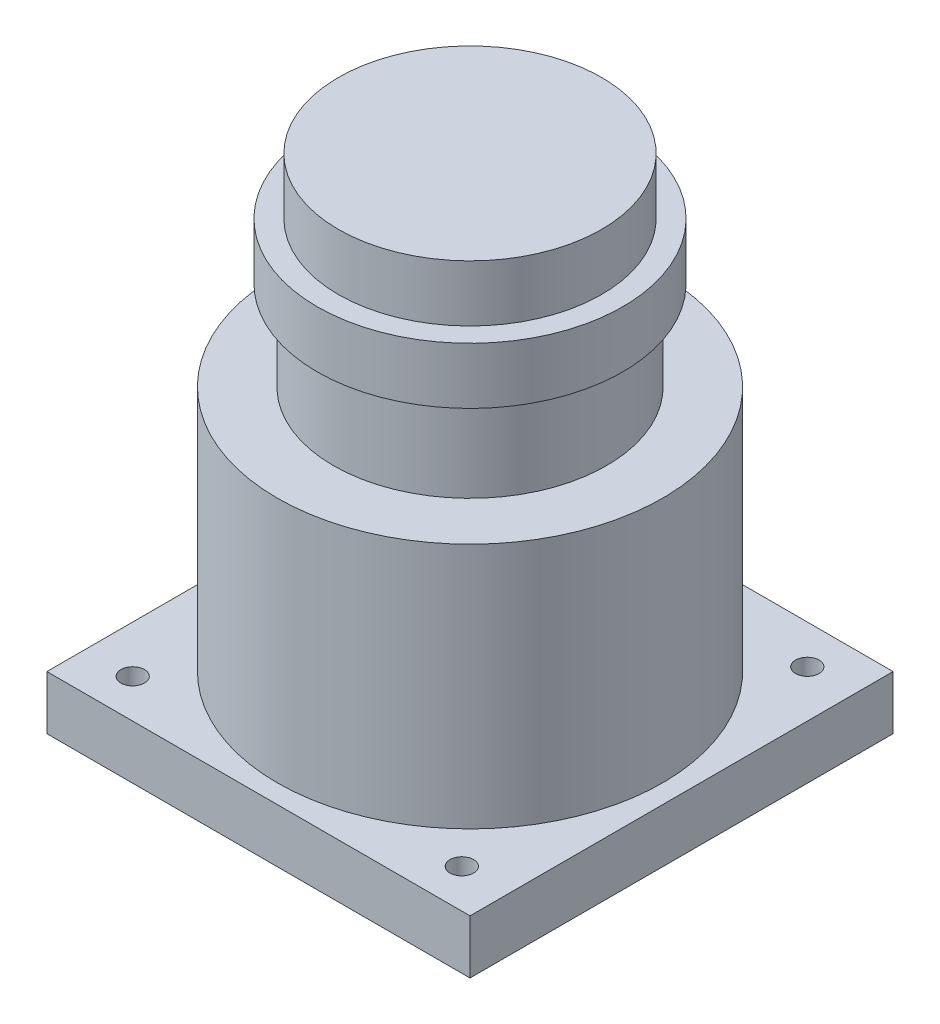
ISO-10303-21;
HEADER;
FILE_DESCRIPTION(('STEP AP214'),'2;1');
FILE_NAME('part.step','',(''),(''),'','','');
FILE_SCHEMA(('AUTOMOTIVE_DESIGN { 1 0 10303 214 1 1 1 1 }'));
ENDSEC;
DATA;
#1=APPLICATION_CONTEXT('core data for automotive mechanical design processes');
#2=APPLICATION_PROTOCOL_DEFINITION('international standard','automotive_design',2000,#1);
#3=PRODUCT_CONTEXT('',#1,'mechanical');
#4=PRODUCT('Part','Part','',(#3));
#5=PRODUCT_RELATED_PRODUCT_CATEGORY('part','',(#4));
#6=PRODUCT_DEFINITION_FORMATION('','',#4);
#7=PRODUCT_DEFINITION_CONTEXT('part definition',#1,'design');
#8=PRODUCT_DEFINITION('design','',#6,#7);
#9=PRODUCT_DEFINITION_SHAPE('','',#8);
#10=(LENGTH_UNIT() NAMED_UNIT(*) SI_UNIT(.MILLI.,.METRE.));
#11=(NAMED_UNIT(*) PLANE_ANGLE_UNIT() SI_UNIT($,.RADIAN.));
#12=(NAMED_UNIT(*) SI_UNIT($,.STERADIAN.) SOLID_ANGLE_UNIT());
#13=UNCERTAINTY_MEASURE_WITH_UNIT(LENGTH_MEASURE(1.E-05),#10,'distance_accuracy_value','');
#14=(GEOMETRIC_REPRESENTATION_CONTEXT(3) GLOBAL_UNCERTAINTY_ASSIGNED_CONTEXT((#13)) GLOBAL_UNIT_ASSIGNED_CONTEXT((#10,
#11,#12)) REPRESENTATION_CONTEXT('',''));
#15=CARTESIAN_POINT('',(0.,0.,0.));
#16=DIRECTION('',(0.,0.,1.));
#17=DIRECTION('',(1.,0.,0.));
#18=AXIS2_PLACEMENT_3D('',#15,#16,#17);
#19=CARTESIAN_POINT('',(45.,11.45,45.));
#20=DIRECTION('',(-1.,0.,0.));
#21=DIRECTION('',(0.,0.,1.));
#22=AXIS2_PLACEMENT_3D('',#19,#20,#21);
#23=PLANE('',#22);
#24=DIRECTION('',(0.,0.,-1.));
#25=VECTOR('',#24,1.);
#26=CARTESIAN_POINT('',(45.,0.,45.));
#27=LINE('',#26,#25);
#28=CARTESIAN_POINT('',(45.,0.,45.));
#29=VERTEX_POINT('',#28);
#30=CARTESIAN_POINT('',(45.,0.,-45.));
#31=VERTEX_POINT('',#30);
#32=EDGE_CURVE('E106',#29,#31,#27,.T.);
#33=ORIENTED_EDGE('',*,*,#32,.T.);
#34=DIRECTION('',(0.,-1.,0.));
#35=VECTOR('',#34,1.);
#36=CARTESIAN_POINT('',(45.,11.45,-45.));
#37=LINE('',#36,#35);
#38=CARTESIAN_POINT('',(45.,11.45,-45.));
#39=VERTEX_POINT('',#38);
#40=EDGE_CURVE('E45',#39,#31,#37,.T.);
#41=ORIENTED_EDGE('',*,*,#40,.F.);
#42=DIRECTION('',(0.,0.,-1.));
#43=VECTOR('',#42,1.);
#44=CARTESIAN_POINT('',(45.,11.45,45.));
#45=LINE('',#44,#43);
#46=CARTESIAN_POINT('',(45.,11.45,45.));
#47=VERTEX_POINT('',#46);
#48=EDGE_CURVE('E91',#47,#39,#45,.T.);
#49=ORIENTED_EDGE('',*,*,#48,.F.);
#50=DIRECTION('',(0.,-1.,0.));
#51=VECTOR('',#50,1.);
#52=CARTESIAN_POINT('',(45.,11.45,45.));
#53=LINE('',#52,#51);
#54=EDGE_CURVE('E105',#47,#29,#53,.T.);
#55=ORIENTED_EDGE('',*,*,#54,.T.);
#56=EDGE_LOOP('',(#33,#41,#49,#55));
#57=FACE_BOUND('',#56,.T.);
#58=ADVANCED_FACE('F39',(#57),#23,.F.);
#59=CARTESIAN_POINT('',(-45.,11.45,-45.));
#60=DIRECTION('',(0.,0.,1.));
#61=DIRECTION('',(1.,0.,0.));
#62=AXIS2_PLACEMENT_3D('',#59,#60,#61);
#63=PLANE('',#62);
#64=DIRECTION('',(-1.,0.,0.));
#65=VECTOR('',#64,1.);
#66=CARTESIAN_POINT('',(-45.,0.,-45.));
#67=LINE('',#66,#65);
#68=CARTESIAN_POINT('',(-45.,0.,-45.));
#69=VERTEX_POINT('',#68);
#70=EDGE_CURVE('E98',#31,#69,#67,.T.);
#71=ORIENTED_EDGE('',*,*,#70,.T.);
#72=DIRECTION('',(0.,-1.,0.));
#73=VECTOR('',#72,1.);
#74=CARTESIAN_POINT('',(-45.,11.45,-45.));
#75=LINE('',#74,#73);
#76=CARTESIAN_POINT('',(-45.,11.45,-45.));
#77=VERTEX_POINT('',#76);
#78=EDGE_CURVE('E96',#77,#69,#75,.T.);
#79=ORIENTED_EDGE('',*,*,#78,.F.);
#80=DIRECTION('',(-1.,0.,0.));
#81=VECTOR('',#80,1.);
#82=CARTESIAN_POINT('',(-45.,11.45,-45.));
#83=LINE('',#82,#81);
#84=EDGE_CURVE('E86',#39,#77,#83,.T.);
#85=ORIENTED_EDGE('',*,*,#84,.F.);
#86=ORIENTED_EDGE('',*,*,#40,.T.);
#87=EDGE_LOOP('',(#71,#79,#85,#86));
#88=FACE_BOUND('',#87,.T.);
#89=ADVANCED_FACE('F100',(#88),#63,.F.);
#90=CARTESIAN_POINT('',(-45.,11.45,45.));
#91=DIRECTION('',(1.,0.,0.));
#92=DIRECTION('',(0.,0.,-1.));
#93=AXIS2_PLACEMENT_3D('',#90,#91,#92);
#94=PLANE('',#93);
#95=DIRECTION('',(0.,0.,1.));
#96=VECTOR('',#95,1.);
#97=CARTESIAN_POINT('',(-45.,0.,45.));
#98=LINE('',#97,#96);
#99=CARTESIAN_POINT('',(-45.,0.,45.));
#100=VERTEX_POINT('',#99);
#101=EDGE_CURVE('E74',#69,#100,#98,.T.);
#102=ORIENTED_EDGE('',*,*,#101,.T.);
#103=DIRECTION('',(0.,-1.,0.));
#104=VECTOR('',#103,1.);
#105=CARTESIAN_POINT('',(-45.,11.45,45.));
#106=LINE('',#105,#104);
#107=CARTESIAN_POINT('',(-45.,11.45,45.));
#108=VERTEX_POINT('',#107);
#109=EDGE_CURVE('E97',#108,#100,#106,.T.);
#110=ORIENTED_EDGE('',*,*,#109,.F.);
#111=DIRECTION('',(0.,0.,1.));
#112=VECTOR('',#111,1.);
#113=CARTESIAN_POINT('',(-45.,11.45,45.));
#114=LINE('',#113,#112);
#115=EDGE_CURVE('E93',#77,#108,#114,.T.);
#116=ORIENTED_EDGE('',*,*,#115,.F.);
#117=ORIENTED_EDGE('',*,*,#78,.T.);
#118=EDGE_LOOP('',(#102,#110,#116,#117));
#119=FACE_BOUND('',#118,.T.);
#120=ADVANCED_FACE('F99',(#119),#94,.F.);
#121=CARTESIAN_POINT('',(-45.,11.45,45.));
#122=DIRECTION('',(0.,0.,-1.));
#123=DIRECTION('',(-1.,0.,0.));
#124=AXIS2_PLACEMENT_3D('',#121,#122,#123);
#125=PLANE('',#124);
#126=DIRECTION('',(1.,0.,0.));
#127=VECTOR('',#126,1.);
#128=CARTESIAN_POINT('',(-45.,0.,45.));
#129=LINE('',#128,#127);
#130=EDGE_CURVE('E77',#100,#29,#129,.T.);
#131=ORIENTED_EDGE('',*,*,#130,.T.);
#132=ORIENTED_EDGE('',*,*,#54,.F.);
#133=DIRECTION('',(1.,0.,0.));
#134=VECTOR('',#133,1.);
#135=CARTESIAN_POINT('',(-45.,11.45,45.));
#136=LINE('',#135,#134);
#137=EDGE_CURVE('E60',#108,#47,#136,.T.);
#138=ORIENTED_EDGE('',*,*,#137,.F.);
#139=ORIENTED_EDGE('',*,*,#109,.T.);
#140=EDGE_LOOP('',(#131,#132,#138,#139));
#141=FACE_BOUND('',#140,.T.);
#142=ADVANCED_FACE('F111',(#141),#125,.F.);
#143=CARTESIAN_POINT('',(0.,11.45,0.));
#144=DIRECTION('',(0.,-1.,0.));
#145=DIRECTION('',(0.,0.,-1.));
#146=AXIS2_PLACEMENT_3D('',#143,#144,#145);
#147=PLANE('',#146);
#148=CARTESIAN_POINT('',(-34.9999999999992,11.45,36.75));
#149=DIRECTION('',(0.,1.,0.));
#150=DIRECTION('',(0.,0.,1.));
#151=AXIS2_PLACEMENT_3D('',#148,#149,#150);
#152=CIRCLE('',#151,2.5);
#153=CARTESIAN_POINT('',(-34.9999999999992,11.45,39.25));
#154=VERTEX_POINT('',#153);
#155=EDGE_CURVE('E149',#154,#154,#152,.T.);
#156=ORIENTED_EDGE('',*,*,#155,.F.);
#157=EDGE_LOOP('',(#156));
#158=FACE_BOUND('',#157,.T.);
#159=CARTESIAN_POINT('',(35.0000000000008,11.45,36.75));
#160=DIRECTION('',(0.,1.,0.));
#161=DIRECTION('',(0.,0.,1.));
#162=AXIS2_PLACEMENT_3D('',#159,#160,#161);
#163=CIRCLE('',#162,2.5);
#164=CARTESIAN_POINT('',(35.0000000000008,11.45,39.25));
#165=VERTEX_POINT('',#164);
#166=EDGE_CURVE('E154',#165,#165,#163,.T.);
#167=ORIENTED_EDGE('',*,*,#166,.F.);
#168=EDGE_LOOP('',(#167));
#169=FACE_BOUND('',#168,.T.);
#170=CARTESIAN_POINT('',(35.,11.45,-36.75));
#171=DIRECTION('',(0.,1.,0.));
#172=DIRECTION('',(0.,0.,1.));
#173=AXIS2_PLACEMENT_3D('',#170,#171,#172);
#174=CIRCLE('',#173,2.5);
#175=CARTESIAN_POINT('',(35.,11.45,-34.25));
#176=VERTEX_POINT('',#175);
#177=EDGE_CURVE('E141',#176,#176,#174,.T.);
#178=ORIENTED_EDGE('',*,*,#177,.F.);
#179=EDGE_LOOP('',(#178));
#180=FACE_BOUND('',#179,.T.);
#181=CARTESIAN_POINT('',(-35.,11.45,-36.75));
#182=DIRECTION('',(0.,1.,0.));
#183=DIRECTION('',(0.,0.,1.));
#184=AXIS2_PLACEMENT_3D('',#181,#182,#183);
#185=CIRCLE('',#184,2.5);
#186=CARTESIAN_POINT('',(-35.,11.45,-34.25));
#187=VERTEX_POINT('',#186);
#188=EDGE_CURVE('E138',#187,#187,#185,.T.);
#189=ORIENTED_EDGE('',*,*,#188,.F.);
#190=EDGE_LOOP('',(#189));
#191=FACE_BOUND('',#190,.T.);
#192=CARTESIAN_POINT('',(0.,11.45,0.));
#193=DIRECTION('',(0.,1.,0.));
#194=DIRECTION('',(0.,0.,1.));
#195=AXIS2_PLACEMENT_3D('',#192,#193,#194);
#196=CIRCLE('',#195,41.);
#197=CARTESIAN_POINT('',(0.,11.45,41.));
#198=VERTEX_POINT('',#197);
#199=EDGE_CURVE('E117',#198,#198,#196,.T.);
#200=ORIENTED_EDGE('',*,*,#199,.F.);
#201=EDGE_LOOP('',(#200));
#202=FACE_BOUND('',#201,.T.);
#203=ORIENTED_EDGE('',*,*,#48,.T.);
#204=ORIENTED_EDGE('',*,*,#84,.T.);
#205=ORIENTED_EDGE('',*,*,#115,.T.);
#206=ORIENTED_EDGE('',*,*,#137,.T.);
#207=EDGE_LOOP('',(#203,#204,#205,#206));
#208=FACE_BOUND('',#207,.T.);
#209=ADVANCED_FACE('F90',(#158,#169,#180,#191,#202,#208),#147,.F.);
#210=CARTESIAN_POINT('',(0.,0.,0.));
#211=DIRECTION('',(0.,-1.,0.));
#212=DIRECTION('',(0.,0.,-1.));
#213=AXIS2_PLACEMENT_3D('',#210,#211,#212);
#214=PLANE('',#213);
#215=CARTESIAN_POINT('',(-34.9999999999992,0.,36.75));
#216=DIRECTION('',(0.,1.,0.));
#217=DIRECTION('',(0.,0.,1.));
#218=AXIS2_PLACEMENT_3D('',#215,#216,#217);
#219=CIRCLE('',#218,2.5);
#220=CARTESIAN_POINT('',(-34.9999999999992,0.,39.25));
#221=VERTEX_POINT('',#220);
#222=EDGE_CURVE('E148',#221,#221,#219,.T.);
#223=ORIENTED_EDGE('',*,*,#222,.T.);
#224=EDGE_LOOP('',(#223));
#225=FACE_BOUND('',#224,.T.);
#226=CARTESIAN_POINT('',(35.0000000000008,0.,36.75));
#227=DIRECTION('',(0.,1.,0.));
#228=DIRECTION('',(0.,0.,1.));
#229=AXIS2_PLACEMENT_3D('',#226,#227,#228);
#230=CIRCLE('',#229,2.5);
#231=CARTESIAN_POINT('',(35.0000000000008,0.,39.25));
#232=VERTEX_POINT('',#231);
#233=EDGE_CURVE('E155',#232,#232,#230,.T.);
#234=ORIENTED_EDGE('',*,*,#233,.T.);
#235=EDGE_LOOP('',(#234));
#236=FACE_BOUND('',#235,.T.);
#237=CARTESIAN_POINT('',(35.,0.,-36.75));
#238=DIRECTION('',(0.,1.,0.));
#239=DIRECTION('',(0.,0.,1.));
#240=AXIS2_PLACEMENT_3D('',#237,#238,#239);
#241=CIRCLE('',#240,2.5);
#242=CARTESIAN_POINT('',(35.,0.,-34.25));
#243=VERTEX_POINT('',#242);
#244=EDGE_CURVE('E158',#243,#243,#241,.T.);
#245=ORIENTED_EDGE('',*,*,#244,.T.);
#246=EDGE_LOOP('',(#245));
#247=FACE_BOUND('',#246,.T.);
#248=CARTESIAN_POINT('',(-35.,0.,-36.75));
#249=DIRECTION('',(0.,1.,0.));
#250=DIRECTION('',(0.,0.,1.));
#251=AXIS2_PLACEMENT_3D('',#248,#249,#250);
#252=CIRCLE('',#251,2.5);
#253=CARTESIAN_POINT('',(-35.,0.,-34.25));
#254=VERTEX_POINT('',#253);
#255=EDGE_CURVE('E136',#254,#254,#252,.T.);
#256=ORIENTED_EDGE('',*,*,#255,.T.);
#257=EDGE_LOOP('',(#256));
#258=FACE_BOUND('',#257,.T.);
#259=ORIENTED_EDGE('',*,*,#32,.F.);
#260=ORIENTED_EDGE('',*,*,#130,.F.);
#261=ORIENTED_EDGE('',*,*,#101,.F.);
#262=ORIENTED_EDGE('',*,*,#70,.F.);
#263=EDGE_LOOP('',(#259,#260,#261,#262));
#264=FACE_BOUND('',#263,.T.);
#265=ADVANCED_FACE('F116',(#225,#236,#247,#258,#264),#214,.T.);
#266=CARTESIAN_POINT('',(0.,63.9,0.));
#267=DIRECTION('',(0.,-1.,0.));
#268=DIRECTION('',(0.,0.,-1.));
#269=AXIS2_PLACEMENT_3D('',#266,#267,#268);
#270=CYLINDRICAL_SURFACE('',#269,41.);
#271=CARTESIAN_POINT('',(0.,63.9,0.));
#272=DIRECTION('',(0.,1.,0.));
#273=DIRECTION('',(0.,0.,1.));
#274=AXIS2_PLACEMENT_3D('',#271,#272,#273);
#275=CIRCLE('',#274,41.);
#276=CARTESIAN_POINT('',(0.,63.9,41.));
#277=VERTEX_POINT('',#276);
#278=EDGE_CURVE('E108',#277,#277,#275,.T.);
#279=ORIENTED_EDGE('',*,*,#278,.F.);
#280=EDGE_LOOP('',(#279));
#281=FACE_BOUND('',#280,.T.);
#282=ORIENTED_EDGE('',*,*,#199,.T.);
#283=EDGE_LOOP('',(#282));
#284=FACE_BOUND('',#283,.T.);
#285=ADVANCED_FACE('F173',(#281,#284),#270,.T.);
#286=CARTESIAN_POINT('',(0.,63.9,0.));
#287=DIRECTION('',(0.,1.,0.));
#288=DIRECTION('',(0.,0.,1.));
#289=AXIS2_PLACEMENT_3D('',#286,#287,#288);
#290=PLANE('',#289);
#291=CARTESIAN_POINT('',(0.,63.9,0.));
#292=DIRECTION('',(0.,1.,0.));
#293=DIRECTION('',(0.,0.,1.));
#294=AXIS2_PLACEMENT_3D('',#291,#292,#293);
#295=CIRCLE('',#294,29.05);
#296=CARTESIAN_POINT('',(0.,63.9,29.05));
#297=VERTEX_POINT('',#296);
#298=EDGE_CURVE('E48',#297,#297,#295,.T.);
#299=ORIENTED_EDGE('',*,*,#298,.F.);
#300=EDGE_LOOP('',(#299));
#301=FACE_BOUND('',#300,.T.);
#302=ORIENTED_EDGE('',*,*,#278,.T.);
#303=EDGE_LOOP('',(#302));
#304=FACE_BOUND('',#303,.T.);
#305=ADVANCED_FACE('F177',(#301,#304),#290,.T.);
#306=CARTESIAN_POINT('',(0.,82.9,0.));
#307=DIRECTION('',(0.,-1.,0.));
#308=DIRECTION('',(0.,0.,-1.));
#309=AXIS2_PLACEMENT_3D('',#306,#307,#308);
#310=CYLINDRICAL_SURFACE('',#309,29.05);
#311=CARTESIAN_POINT('',(0.,82.9,0.));
#312=DIRECTION('',(0.,1.,0.));
#313=DIRECTION('',(0.,0.,1.));
#314=AXIS2_PLACEMENT_3D('',#311,#312,#313);
#315=CIRCLE('',#314,29.05);
#316=CARTESIAN_POINT('',(0.,82.9,29.05));
#317=VERTEX_POINT('',#316);
#318=EDGE_CURVE('E123',#317,#317,#315,.T.);
#319=ORIENTED_EDGE('',*,*,#318,.F.);
#320=EDGE_LOOP('',(#319));
#321=FACE_BOUND('',#320,.T.);
#322=ORIENTED_EDGE('',*,*,#298,.T.);
#323=EDGE_LOOP('',(#322));
#324=FACE_BOUND('',#323,.T.);
#325=ADVANCED_FACE('F181',(#321,#324),#310,.T.);
#326=CARTESIAN_POINT('',(0.,94.9,0.));
#327=DIRECTION('',(0.,-1.,0.));
#328=DIRECTION('',(0.,0.,-1.));
#329=AXIS2_PLACEMENT_3D('',#326,#327,#328);
#330=CYLINDRICAL_SURFACE('',#329,32.5);
#331=CARTESIAN_POINT('',(0.,94.9,0.));
#332=DIRECTION('',(0.,1.,0.));
#333=DIRECTION('',(0.,0.,1.));
#334=AXIS2_PLACEMENT_3D('',#331,#332,#333);
#335=CIRCLE('',#334,32.5);
#336=CARTESIAN_POINT('',(0.,94.9,32.5));
#337=VERTEX_POINT('',#336);
#338=EDGE_CURVE('E128',#337,#337,#335,.T.);
#339=ORIENTED_EDGE('',*,*,#338,.F.);
#340=EDGE_LOOP('',(#339));
#341=FACE_BOUND('',#340,.T.);
#342=CARTESIAN_POINT('',(0.,82.9,0.));
#343=DIRECTION('',(0.,1.,0.));
#344=DIRECTION('',(0.,0.,1.));
#345=AXIS2_PLACEMENT_3D('',#342,#343,#344);
#346=CIRCLE('',#345,32.5);
#347=CARTESIAN_POINT('',(0.,82.9,32.5));
#348=VERTEX_POINT('',#347);
#349=EDGE_CURVE('E134',#348,#348,#346,.T.);
#350=ORIENTED_EDGE('',*,*,#349,.T.);
#351=EDGE_LOOP('',(#350));
#352=FACE_BOUND('',#351,.T.);
#353=ADVANCED_FACE('F245',(#341,#352),#330,.T.);
#354=CARTESIAN_POINT('',(0.,94.9,0.));
#355=DIRECTION('',(0.,1.,0.));
#356=DIRECTION('',(0.,0.,1.));
#357=AXIS2_PLACEMENT_3D('',#354,#355,#356);
#358=PLANE('',#357);
#359=CARTESIAN_POINT('',(0.,94.9,0.));
#360=DIRECTION('',(0.,1.,0.));
#361=DIRECTION('',(0.,0.,1.));
#362=AXIS2_PLACEMENT_3D('',#359,#360,#361);
#363=CIRCLE('',#362,28.);
#364=CARTESIAN_POINT('',(0.,94.9,28.));
#365=VERTEX_POINT('',#364);
#366=EDGE_CURVE('E11',#365,#365,#363,.T.);
#367=ORIENTED_EDGE('',*,*,#366,.F.);
#368=EDGE_LOOP('',(#367));
#369=FACE_BOUND('',#368,.T.);
#370=ORIENTED_EDGE('',*,*,#338,.T.);
#371=EDGE_LOOP('',(#370));
#372=FACE_BOUND('',#371,.T.);
#373=ADVANCED_FACE('F252',(#369,#372),#358,.T.);
#374=CARTESIAN_POINT('',(0.,82.9,0.));
#375=DIRECTION('',(0.,1.,0.));
#376=DIRECTION('',(0.,0.,1.));
#377=AXIS2_PLACEMENT_3D('',#374,#375,#376);
#378=PLANE('',#377);
#379=ORIENTED_EDGE('',*,*,#318,.T.);
#380=EDGE_LOOP('',(#379));
#381=FACE_BOUND('',#380,.T.);
#382=ORIENTED_EDGE('',*,*,#349,.F.);
#383=EDGE_LOOP('',(#382));
#384=FACE_BOUND('',#383,.T.);
#385=ADVANCED_FACE('F261',(#381,#384),#378,.F.);
#386=CARTESIAN_POINT('',(0.,106.9,0.));
#387=DIRECTION('',(0.,-1.,0.));
#388=DIRECTION('',(0.,0.,-1.));
#389=AXIS2_PLACEMENT_3D('',#386,#387,#388);
#390=CYLINDRICAL_SURFACE('',#389,28.);
#391=CARTESIAN_POINT('',(0.,106.9,0.));
#392=DIRECTION('',(0.,1.,0.));
#393=DIRECTION('',(0.,0.,1.));
#394=AXIS2_PLACEMENT_3D('',#391,#392,#393);
#395=CIRCLE('',#394,28.);
#396=CARTESIAN_POINT('',(0.,106.9,28.));
#397=VERTEX_POINT('',#396);
#398=EDGE_CURVE('E133',#397,#397,#395,.T.);
#399=ORIENTED_EDGE('',*,*,#398,.F.);
#400=EDGE_LOOP('',(#399));
#401=FACE_BOUND('',#400,.T.);
#402=ORIENTED_EDGE('',*,*,#366,.T.);
#403=EDGE_LOOP('',(#402));
#404=FACE_BOUND('',#403,.T.);
#405=ADVANCED_FACE('F269',(#401,#404),#390,.T.);
#406=CARTESIAN_POINT('',(0.,106.9,0.));
#407=DIRECTION('',(0.,1.,0.));
#408=DIRECTION('',(0.,0.,1.));
#409=AXIS2_PLACEMENT_3D('',#406,#407,#408);
#410=PLANE('',#409);
#411=ORIENTED_EDGE('',*,*,#398,.T.);
#412=EDGE_LOOP('',(#411));
#413=FACE_BOUND('',#412,.T.);
#414=ADVANCED_FACE('F276',(#413),#410,.T.);
#415=CARTESIAN_POINT('',(-35.,0.,-36.75));
#416=DIRECTION('',(0.,1.,0.));
#417=DIRECTION('',(0.,0.,1.));
#418=AXIS2_PLACEMENT_3D('',#415,#416,#417);
#419=CYLINDRICAL_SURFACE('',#418,2.5);
#420=ORIENTED_EDGE('',*,*,#255,.F.);
#421=EDGE_LOOP('',(#420));
#422=FACE_BOUND('',#421,.T.);
#423=ORIENTED_EDGE('',*,*,#188,.T.);
#424=EDGE_LOOP('',(#423));
#425=FACE_BOUND('',#424,.T.);
#426=ADVANCED_FACE('F289',(#422,#425),#419,.F.);
#427=CARTESIAN_POINT('',(35.,0.,-36.75));
#428=DIRECTION('',(0.,1.,0.));
#429=DIRECTION('',(0.,0.,1.));
#430=AXIS2_PLACEMENT_3D('',#427,#428,#429);
#431=CYLINDRICAL_SURFACE('',#430,2.5);
#432=ORIENTED_EDGE('',*,*,#244,.F.);
#433=EDGE_LOOP('',(#432));
#434=FACE_BOUND('',#433,.T.);
#435=ORIENTED_EDGE('',*,*,#177,.T.);
#436=EDGE_LOOP('',(#435));
#437=FACE_BOUND('',#436,.T.);
#438=ADVANCED_FACE('F163',(#434,#437),#431,.F.);
#439=CARTESIAN_POINT('',(35.0000000000008,0.,36.75));
#440=DIRECTION('',(0.,1.,0.));
#441=DIRECTION('',(0.,0.,1.));
#442=AXIS2_PLACEMENT_3D('',#439,#440,#441);
#443=CYLINDRICAL_SURFACE('',#442,2.5);
#444=ORIENTED_EDGE('',*,*,#233,.F.);
#445=EDGE_LOOP('',(#444));
#446=FACE_BOUND('',#445,.T.);
#447=ORIENTED_EDGE('',*,*,#166,.T.);
#448=EDGE_LOOP('',(#447));
#449=FACE_BOUND('',#448,.T.);
#450=ADVANCED_FACE('F303',(#446,#449),#443,.F.);
#451=CARTESIAN_POINT('',(-34.9999999999992,0.,36.75));
#452=DIRECTION('',(0.,1.,0.));
#453=DIRECTION('',(0.,0.,1.));
#454=AXIS2_PLACEMENT_3D('',#451,#452,#453);
#455=CYLINDRICAL_SURFACE('',#454,2.5);
#456=ORIENTED_EDGE('',*,*,#222,.F.);
#457=EDGE_LOOP('',(#456));
#458=FACE_BOUND('',#457,.T.);
#459=ORIENTED_EDGE('',*,*,#155,.T.);
#460=EDGE_LOOP('',(#459));
#461=FACE_BOUND('',#460,.T.);
#462=ADVANCED_FACE('F314',(#458,#461),#455,.F.);
#463=CLOSED_SHELL('',(#58,#89,#120,#142,#209,#265,#285,#305,#325,#353,#373,#385,#405,#414,#426,
#438,#450,#462));
#464=MANIFOLD_SOLID_BREP('B2',#463);
#465=ADVANCED_BREP_SHAPE_REPRESENTATION('',(#18,#464),#14);
#466=SHAPE_DEFINITION_REPRESENTATION(#9,#465);
ENDSEC;
END-ISO-10303-21;
